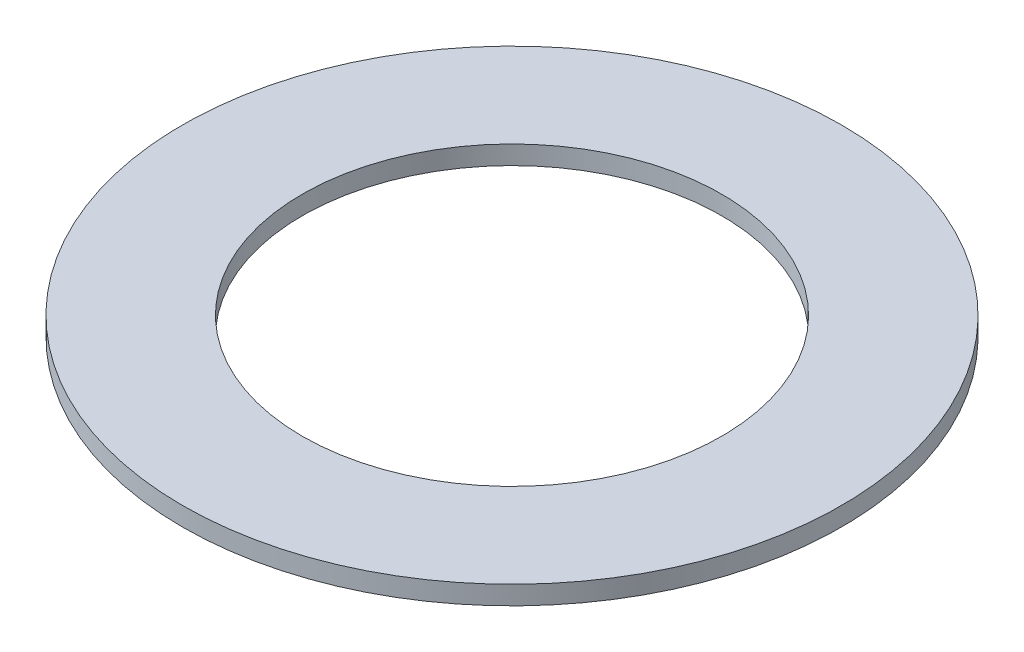
ISO-10303-21;
HEADER;
FILE_DESCRIPTION(('STEP AP214'),'2;1');
FILE_NAME('part.step','',(''),(''),'','','');
FILE_SCHEMA(('AUTOMOTIVE_DESIGN { 1 0 10303 214 1 1 1 1 }'));
ENDSEC;
DATA;
#1=APPLICATION_CONTEXT('core data for automotive mechanical design processes');
#2=APPLICATION_PROTOCOL_DEFINITION('international standard','automotive_design',2000,#1);
#3=PRODUCT_CONTEXT('',#1,'mechanical');
#4=PRODUCT('Part','Part','',(#3));
#5=PRODUCT_RELATED_PRODUCT_CATEGORY('part','',(#4));
#6=PRODUCT_DEFINITION_FORMATION('','',#4);
#7=PRODUCT_DEFINITION_CONTEXT('part definition',#1,'design');
#8=PRODUCT_DEFINITION('design','',#6,#7);
#9=PRODUCT_DEFINITION_SHAPE('','',#8);
#10=(LENGTH_UNIT() NAMED_UNIT(*) SI_UNIT(.MILLI.,.METRE.));
#11=(NAMED_UNIT(*) PLANE_ANGLE_UNIT() SI_UNIT($,.RADIAN.));
#12=(NAMED_UNIT(*) SI_UNIT($,.STERADIAN.) SOLID_ANGLE_UNIT());
#13=UNCERTAINTY_MEASURE_WITH_UNIT(LENGTH_MEASURE(1.E-05),#10,'distance_accuracy_value','');
#14=(GEOMETRIC_REPRESENTATION_CONTEXT(3) GLOBAL_UNCERTAINTY_ASSIGNED_CONTEXT((#13)) GLOBAL_UNIT_ASSIGNED_CONTEXT((#10,
#11,#12)) REPRESENTATION_CONTEXT('',''));
#15=CARTESIAN_POINT('',(0.,0.,0.));
#16=DIRECTION('',(0.,0.,1.));
#17=DIRECTION('',(1.,0.,0.));
#18=AXIS2_PLACEMENT_3D('',#15,#16,#17);
#19=CARTESIAN_POINT('',(0.,0.125,0.));
#20=DIRECTION('',(0.,1.,0.));
#21=DIRECTION('',(0.,0.,1.));
#22=AXIS2_PLACEMENT_3D('',#19,#20,#21);
#23=PLANE('',#22);
#24=CARTESIAN_POINT('',(0.,0.125,0.));
#25=DIRECTION('',(0.,1.,0.));
#26=DIRECTION('',(0.,0.,1.));
#27=AXIS2_PLACEMENT_3D('',#24,#25,#26);
#28=CIRCLE('',#27,4.4);
#29=CARTESIAN_POINT('',(0.,0.125,4.4));
#30=VERTEX_POINT('',#29);
#31=EDGE_CURVE('E10',#30,#30,#28,.T.);
#32=ORIENTED_EDGE('',*,*,#31,.T.);
#33=EDGE_LOOP('',(#32));
#34=FACE_BOUND('',#33,.T.);
#35=CARTESIAN_POINT('',(0.,0.125,0.));
#36=DIRECTION('',(0.,1.,0.));
#37=DIRECTION('',(0.,0.,1.));
#38=AXIS2_PLACEMENT_3D('',#35,#36,#37);
#39=CIRCLE('',#38,2.8);
#40=CARTESIAN_POINT('',(0.,0.125,2.8));
#41=VERTEX_POINT('',#40);
#42=EDGE_CURVE('E42',#41,#41,#39,.T.);
#43=ORIENTED_EDGE('',*,*,#42,.F.);
#44=EDGE_LOOP('',(#43));
#45=FACE_BOUND('',#44,.T.);
#46=ADVANCED_FACE('F31',(#34,#45),#23,.T.);
#47=CARTESIAN_POINT('',(0.,-0.125,0.));
#48=DIRECTION('',(0.,1.,0.));
#49=DIRECTION('',(0.,0.,1.));
#50=AXIS2_PLACEMENT_3D('',#47,#48,#49);
#51=PLANE('',#50);
#52=CARTESIAN_POINT('',(0.,-0.125,0.));
#53=DIRECTION('',(0.,1.,0.));
#54=DIRECTION('',(0.,0.,1.));
#55=AXIS2_PLACEMENT_3D('',#52,#53,#54);
#56=CIRCLE('',#55,4.4);
#57=CARTESIAN_POINT('',(0.,-0.125,4.4));
#58=VERTEX_POINT('',#57);
#59=EDGE_CURVE('E35',#58,#58,#56,.T.);
#60=ORIENTED_EDGE('',*,*,#59,.F.);
#61=EDGE_LOOP('',(#60));
#62=FACE_BOUND('',#61,.T.);
#63=CARTESIAN_POINT('',(0.,-0.125,0.));
#64=DIRECTION('',(0.,1.,0.));
#65=DIRECTION('',(0.,0.,1.));
#66=AXIS2_PLACEMENT_3D('',#63,#64,#65);
#67=CIRCLE('',#66,2.8);
#68=CARTESIAN_POINT('',(0.,-0.125,2.8));
#69=VERTEX_POINT('',#68);
#70=EDGE_CURVE('E44',#69,#69,#67,.T.);
#71=ORIENTED_EDGE('',*,*,#70,.T.);
#72=EDGE_LOOP('',(#71));
#73=FACE_BOUND('',#72,.T.);
#74=ADVANCED_FACE('F54',(#62,#73),#51,.F.);
#75=CARTESIAN_POINT('',(0.,0.125,0.));
#76=DIRECTION('',(0.,-1.,0.));
#77=DIRECTION('',(0.,0.,-1.));
#78=AXIS2_PLACEMENT_3D('',#75,#76,#77);
#79=CYLINDRICAL_SURFACE('',#78,4.4);
#80=ORIENTED_EDGE('',*,*,#31,.F.);
#81=EDGE_LOOP('',(#80));
#82=FACE_BOUND('',#81,.T.);
#83=ORIENTED_EDGE('',*,*,#59,.T.);
#84=EDGE_LOOP('',(#83));
#85=FACE_BOUND('',#84,.T.);
#86=ADVANCED_FACE('F33',(#82,#85),#79,.T.);
#87=CARTESIAN_POINT('',(0.,0.125,0.));
#88=DIRECTION('',(0.,-1.,0.));
#89=DIRECTION('',(0.,0.,-1.));
#90=AXIS2_PLACEMENT_3D('',#87,#88,#89);
#91=CYLINDRICAL_SURFACE('',#90,2.8);
#92=ORIENTED_EDGE('',*,*,#42,.T.);
#93=EDGE_LOOP('',(#92));
#94=FACE_BOUND('',#93,.T.);
#95=ORIENTED_EDGE('',*,*,#70,.F.);
#96=EDGE_LOOP('',(#95));
#97=FACE_BOUND('',#96,.T.);
#98=ADVANCED_FACE('F50',(#94,#97),#91,.F.);
#99=CLOSED_SHELL('',(#46,#74,#86,#98));
#100=MANIFOLD_SOLID_BREP('B2',#99);
#101=ADVANCED_BREP_SHAPE_REPRESENTATION('',(#18,#100),#14);
#102=SHAPE_DEFINITION_REPRESENTATION(#9,#101);
ENDSEC;
END-ISO-10303-21;
